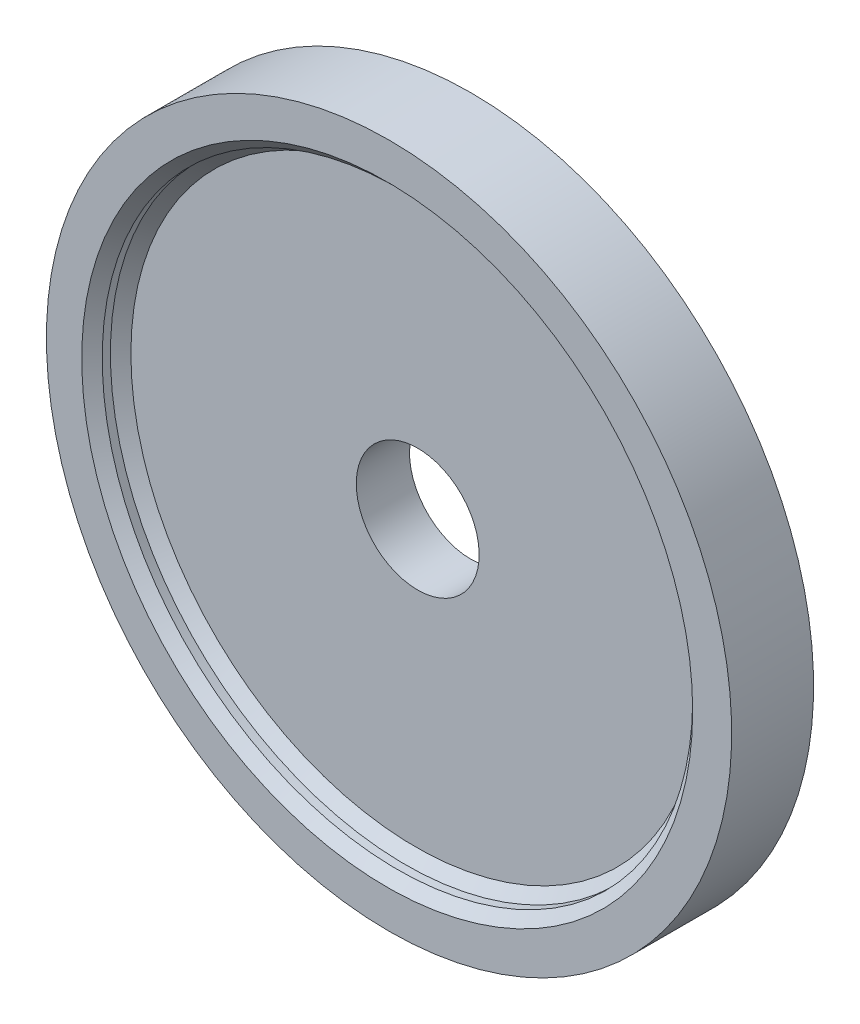
ISO-10303-21;
HEADER;
FILE_DESCRIPTION(('STEP AP214'),'2;1');
FILE_NAME('part.step','',(''),(''),'','','');
FILE_SCHEMA(('AUTOMOTIVE_DESIGN { 1 0 10303 214 1 1 1 1 }'));
ENDSEC;
DATA;
#1=APPLICATION_CONTEXT('core data for automotive mechanical design processes');
#2=APPLICATION_PROTOCOL_DEFINITION('international standard','automotive_design',2000,#1);
#3=PRODUCT_CONTEXT('',#1,'mechanical');
#4=PRODUCT('Part','Part','',(#3));
#5=PRODUCT_RELATED_PRODUCT_CATEGORY('part','',(#4));
#6=PRODUCT_DEFINITION_FORMATION('','',#4);
#7=PRODUCT_DEFINITION_CONTEXT('part definition',#1,'design');
#8=PRODUCT_DEFINITION('design','',#6,#7);
#9=PRODUCT_DEFINITION_SHAPE('','',#8);
#10=(LENGTH_UNIT() NAMED_UNIT(*) SI_UNIT(.MILLI.,.METRE.));
#11=(NAMED_UNIT(*) PLANE_ANGLE_UNIT() SI_UNIT($,.RADIAN.));
#12=(NAMED_UNIT(*) SI_UNIT($,.STERADIAN.) SOLID_ANGLE_UNIT());
#13=UNCERTAINTY_MEASURE_WITH_UNIT(LENGTH_MEASURE(1.E-05),#10,'distance_accuracy_value','');
#14=(GEOMETRIC_REPRESENTATION_CONTEXT(3) GLOBAL_UNCERTAINTY_ASSIGNED_CONTEXT((#13)) GLOBAL_UNIT_ASSIGNED_CONTEXT((#10,
#11,#12)) REPRESENTATION_CONTEXT('',''));
#15=CARTESIAN_POINT('',(0.,0.,0.));
#16=DIRECTION('',(0.,0.,1.));
#17=DIRECTION('',(1.,0.,0.));
#18=AXIS2_PLACEMENT_3D('',#15,#16,#17);
#19=CARTESIAN_POINT('',(0.04475125,0.,20.));
#20=DIRECTION('',(0.,0.,1.));
#21=DIRECTION('',(0.,-1.,0.));
#22=AXIS2_PLACEMENT_3D('',#19,#20,#21);
#23=CYLINDRICAL_SURFACE('',#22,1.5);
#24=CARTESIAN_POINT('',(0.04475125,0.,21.3));
#25=DIRECTION('',(0.,0.,1.));
#26=DIRECTION('',(0.,-1.,0.));
#27=AXIS2_PLACEMENT_3D('',#24,#25,#26);
#28=CIRCLE('',#27,1.5);
#29=CARTESIAN_POINT('',(0.04475125,-1.5,21.3));
#30=VERTEX_POINT('',#29);
#31=EDGE_CURVE('E19',#30,#30,#28,.F.);
#32=ORIENTED_EDGE('',*,*,#31,.F.);
#33=EDGE_LOOP('',(#32));
#34=FACE_BOUND('',#33,.T.);
#35=CARTESIAN_POINT('',(0.04475125,0.,20.));
#36=DIRECTION('',(0.,0.,1.));
#37=DIRECTION('',(0.,-1.,0.));
#38=AXIS2_PLACEMENT_3D('',#35,#36,#37);
#39=CIRCLE('',#38,1.5);
#40=CARTESIAN_POINT('',(0.04475125,-1.5,20.));
#41=VERTEX_POINT('',#40);
#42=EDGE_CURVE('E40',#41,#41,#39,.T.);
#43=ORIENTED_EDGE('',*,*,#42,.F.);
#44=EDGE_LOOP('',(#43));
#45=FACE_BOUND('',#44,.T.);
#46=ADVANCED_FACE('F15',(#34,#45),#23,.F.);
#47=CARTESIAN_POINT('',(-7.041923586,-7.041923586,21.3));
#48=DIRECTION('',(0.,0.,1.));
#49=DIRECTION('',(1.,0.,0.));
#50=AXIS2_PLACEMENT_3D('',#47,#48,#49);
#51=PLANE('',#50);
#52=ORIENTED_EDGE('',*,*,#31,.T.);
#53=EDGE_LOOP('',(#52));
#54=FACE_BOUND('',#53,.T.);
#55=CARTESIAN_POINT('',(0.,0.,21.3));
#56=DIRECTION('',(0.,0.,1.));
#57=DIRECTION('',(1.,0.,0.));
#58=AXIS2_PLACEMENT_3D('',#55,#56,#57);
#59=CIRCLE('',#58,6.95842251599999);
#60=CARTESIAN_POINT('',(6.95842251599999,0.,21.3));
#61=VERTEX_POINT('',#60);
#62=EDGE_CURVE('E38',#61,#61,#59,.F.);
#63=ORIENTED_EDGE('',*,*,#62,.F.);
#64=EDGE_LOOP('',(#63));
#65=FACE_BOUND('',#64,.T.);
#66=ADVANCED_FACE('F47',(#54,#65),#51,.T.);
#67=CARTESIAN_POINT('',(8.510968784,-8.466217534,20.));
#68=DIRECTION('',(0.,0.,-1.));
#69=DIRECTION('',(-1.,0.,0.));
#70=AXIS2_PLACEMENT_3D('',#67,#68,#69);
#71=PLANE('',#70);
#72=ORIENTED_EDGE('',*,*,#42,.T.);
#73=EDGE_LOOP('',(#72));
#74=FACE_BOUND('',#73,.T.);
#75=CARTESIAN_POINT('',(0.0447512499999999,0.,20.));
#76=DIRECTION('',(0.,0.,1.));
#77=DIRECTION('',(0.,-1.,0.));
#78=AXIS2_PLACEMENT_3D('',#75,#76,#77);
#79=CIRCLE('',#78,8.365827603);
#80=CARTESIAN_POINT('',(0.0447512499999999,-8.365827603,20.));
#81=VERTEX_POINT('',#80);
#82=EDGE_CURVE('E35',#81,#81,#79,.F.);
#83=ORIENTED_EDGE('',*,*,#82,.T.);
#84=EDGE_LOOP('',(#83));
#85=FACE_BOUND('',#84,.T.);
#86=ADVANCED_FACE('F57',(#74,#85),#71,.T.);
#87=CARTESIAN_POINT('',(0.,0.,21.3));
#88=DIRECTION('',(0.,0.,1.));
#89=DIRECTION('',(1.,0.,0.));
#90=AXIS2_PLACEMENT_3D('',#87,#88,#89);
#91=CONICAL_SURFACE('',#90,6.958422516,0.785398163397447);
#92=ORIENTED_EDGE('',*,*,#62,.T.);
#93=EDGE_LOOP('',(#92));
#94=FACE_BOUND('',#93,.T.);
#95=CARTESIAN_POINT('',(0.,0.,21.55));
#96=DIRECTION('',(0.,0.,1.));
#97=DIRECTION('',(1.,0.,0.));
#98=AXIS2_PLACEMENT_3D('',#95,#96,#97);
#99=CIRCLE('',#98,7.208422516);
#100=CARTESIAN_POINT('',(7.208422516,0.,21.55));
#101=VERTEX_POINT('',#100);
#102=EDGE_CURVE('E32',#101,#101,#99,.F.);
#103=ORIENTED_EDGE('',*,*,#102,.F.);
#104=EDGE_LOOP('',(#103));
#105=FACE_BOUND('',#104,.T.);
#106=ADVANCED_FACE('F75',(#94,#105),#91,.F.);
#107=CARTESIAN_POINT('',(0.0447512499999999,0.,20.));
#108=DIRECTION('',(0.,0.,1.));
#109=DIRECTION('',(0.,-1.,0.));
#110=AXIS2_PLACEMENT_3D('',#107,#108,#109);
#111=CYLINDRICAL_SURFACE('',#110,8.365827603);
#112=ORIENTED_EDGE('',*,*,#82,.F.);
#113=EDGE_LOOP('',(#112));
#114=FACE_BOUND('',#113,.T.);
#115=CARTESIAN_POINT('',(0.0447512499999999,0.,22.));
#116=DIRECTION('',(0.,0.,1.));
#117=DIRECTION('',(0.,-1.,0.));
#118=AXIS2_PLACEMENT_3D('',#115,#116,#117);
#119=CIRCLE('',#118,8.365827603);
#120=CARTESIAN_POINT('',(0.0447512499999999,-8.365827603,22.));
#121=VERTEX_POINT('',#120);
#122=EDGE_CURVE('E28',#121,#121,#119,.T.);
#123=ORIENTED_EDGE('',*,*,#122,.F.);
#124=EDGE_LOOP('',(#123));
#125=FACE_BOUND('',#124,.T.);
#126=ADVANCED_FACE('F72',(#114,#125),#111,.T.);
#127=CARTESIAN_POINT('',(0.,0.,21.55));
#128=DIRECTION('',(0.,0.,1.));
#129=DIRECTION('',(1.,0.,0.));
#130=AXIS2_PLACEMENT_3D('',#127,#128,#129);
#131=CYLINDRICAL_SURFACE('',#130,7.208422516);
#132=ORIENTED_EDGE('',*,*,#102,.T.);
#133=EDGE_LOOP('',(#132));
#134=FACE_BOUND('',#133,.T.);
#135=CARTESIAN_POINT('',(0.,0.,21.7499999999999));
#136=DIRECTION('',(0.,0.,1.));
#137=DIRECTION('',(1.,0.,0.));
#138=AXIS2_PLACEMENT_3D('',#135,#136,#137);
#139=CIRCLE('',#138,7.208422516);
#140=CARTESIAN_POINT('',(7.208422516,0.,21.75));
#141=VERTEX_POINT('',#140);
#142=EDGE_CURVE('E23',#141,#141,#139,.F.);
#143=ORIENTED_EDGE('',*,*,#142,.F.);
#144=EDGE_LOOP('',(#143));
#145=FACE_BOUND('',#144,.T.);
#146=ADVANCED_FACE('F67',(#134,#145),#131,.F.);
#147=CARTESIAN_POINT('',(-8.421466284,-8.466217534,22.));
#148=DIRECTION('',(0.,0.,1.));
#149=DIRECTION('',(1.,0.,0.));
#150=AXIS2_PLACEMENT_3D('',#147,#148,#149);
#151=PLANE('',#150);
#152=CARTESIAN_POINT('',(0.,0.,22.));
#153=DIRECTION('',(0.,0.,1.));
#154=DIRECTION('',(1.,0.,0.));
#155=AXIS2_PLACEMENT_3D('',#152,#153,#154);
#156=CIRCLE('',#155,7.45842251600002);
#157=CARTESIAN_POINT('',(7.45842251600002,0.,22.));
#158=VERTEX_POINT('',#157);
#159=EDGE_CURVE('E10',#158,#158,#156,.T.);
#160=ORIENTED_EDGE('',*,*,#159,.F.);
#161=EDGE_LOOP('',(#160));
#162=FACE_BOUND('',#161,.T.);
#163=ORIENTED_EDGE('',*,*,#122,.T.);
#164=EDGE_LOOP('',(#163));
#165=FACE_BOUND('',#164,.T.);
#166=ADVANCED_FACE('F17',(#162,#165),#151,.T.);
#167=CARTESIAN_POINT('',(0.,0.,21.75));
#168=DIRECTION('',(0.,0.,1.));
#169=DIRECTION('',(1.,0.,0.));
#170=AXIS2_PLACEMENT_3D('',#167,#168,#169);
#171=CONICAL_SURFACE('',#170,7.208422516,0.785398163397455);
#172=ORIENTED_EDGE('',*,*,#142,.T.);
#173=EDGE_LOOP('',(#172));
#174=FACE_BOUND('',#173,.T.);
#175=ORIENTED_EDGE('',*,*,#159,.T.);
#176=EDGE_LOOP('',(#175));
#177=FACE_BOUND('',#176,.T.);
#178=ADVANCED_FACE('F60',(#174,#177),#171,.F.);
#179=CLOSED_SHELL('',(#46,#66,#86,#106,#126,#146,#166,#178));
#180=MANIFOLD_SOLID_BREP('B1',#179);
#181=ADVANCED_BREP_SHAPE_REPRESENTATION('',(#18,#180),#14);
#182=SHAPE_DEFINITION_REPRESENTATION(#9,#181);
ENDSEC;
END-ISO-10303-21;
